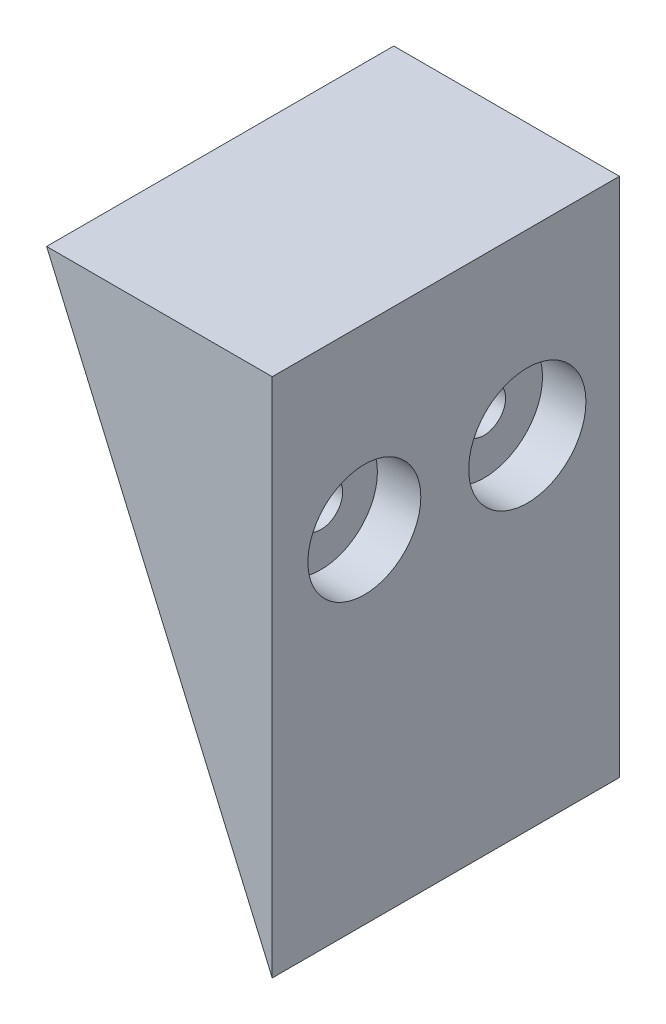
ISO-10303-21;
HEADER;
FILE_DESCRIPTION(('STEP AP214'),'2;1');
FILE_NAME('part.step','',(''),(''),'','','');
FILE_SCHEMA(('AUTOMOTIVE_DESIGN { 1 0 10303 214 1 1 1 1 }'));
ENDSEC;
DATA;
#1=APPLICATION_CONTEXT('core data for automotive mechanical design processes');
#2=APPLICATION_PROTOCOL_DEFINITION('international standard','automotive_design',2000,#1);
#3=PRODUCT_CONTEXT('',#1,'mechanical');
#4=PRODUCT('Part','Part','',(#3));
#5=PRODUCT_RELATED_PRODUCT_CATEGORY('part','',(#4));
#6=PRODUCT_DEFINITION_FORMATION('','',#4);
#7=PRODUCT_DEFINITION_CONTEXT('part definition',#1,'design');
#8=PRODUCT_DEFINITION('design','',#6,#7);
#9=PRODUCT_DEFINITION_SHAPE('','',#8);
#10=(LENGTH_UNIT() NAMED_UNIT(*) SI_UNIT(.MILLI.,.METRE.));
#11=(NAMED_UNIT(*) PLANE_ANGLE_UNIT() SI_UNIT($,.RADIAN.));
#12=(NAMED_UNIT(*) SI_UNIT($,.STERADIAN.) SOLID_ANGLE_UNIT());
#13=UNCERTAINTY_MEASURE_WITH_UNIT(LENGTH_MEASURE(1.E-05),#10,'distance_accuracy_value','');
#14=(GEOMETRIC_REPRESENTATION_CONTEXT(3) GLOBAL_UNCERTAINTY_ASSIGNED_CONTEXT((#13)) GLOBAL_UNIT_ASSIGNED_CONTEXT((#10,
#11,#12)) REPRESENTATION_CONTEXT('',''));
#15=CARTESIAN_POINT('',(0.,0.,0.));
#16=DIRECTION('',(0.,0.,1.));
#17=DIRECTION('',(1.,0.,0.));
#18=AXIS2_PLACEMENT_3D('',#15,#16,#17);
#19=CARTESIAN_POINT('',(-80.,39.440308957154,10.6119529384827));
#20=DIRECTION('',(1.,0.,0.));
#21=DIRECTION('',(0.,0.,-1.));
#22=AXIS2_PLACEMENT_3D('',#19,#20,#21);
#23=CYLINDRICAL_SURFACE('',#22,2.5);
#24=CARTESIAN_POINT('',(-17.0908005481001,39.440308957154,10.6119529384827));
#25=DIRECTION('',(0.917555625309924,0.397607437634301,0.));
#26=DIRECTION('',(0.3976074376343,-0.917555625309924,0.));
#27=AXIS2_PLACEMENT_3D('',#24,#25,#26);
#28=ELLIPSE('',#27,2.7246304540453,2.5);
#29=CARTESIAN_POINT('',(-16.0074672147667,36.940308957154,10.6119529384827));
#30=VERTEX_POINT('',#29);
#31=EDGE_CURVE('E90',#30,#30,#28,.T.);
#32=ORIENTED_EDGE('',*,*,#31,.F.);
#33=EDGE_LOOP('',(#32));
#34=FACE_BOUND('',#33,.T.);
#35=CARTESIAN_POINT('',(-5.,39.440308957154,10.6119529384827));
#36=DIRECTION('',(1.,0.,0.));
#37=DIRECTION('',(0.,0.,-1.));
#38=AXIS2_PLACEMENT_3D('',#35,#36,#37);
#39=CIRCLE('',#38,2.5);
#40=CARTESIAN_POINT('',(-5.,39.440308957154,8.11195293848271));
#41=VERTEX_POINT('',#40);
#42=EDGE_CURVE('E37',#41,#41,#39,.F.);
#43=ORIENTED_EDGE('',*,*,#42,.F.);
#44=EDGE_LOOP('',(#43));
#45=FACE_BOUND('',#44,.T.);
#46=ADVANCED_FACE('F33',(#34,#45),#23,.F.);
#47=CARTESIAN_POINT('',(-80.,39.440308957154,29.3880470615173));
#48=DIRECTION('',(1.,0.,0.));
#49=DIRECTION('',(0.,0.,-1.));
#50=AXIS2_PLACEMENT_3D('',#47,#48,#49);
#51=CYLINDRICAL_SURFACE('',#50,2.5);
#52=CARTESIAN_POINT('',(-17.0908005481001,39.440308957154,29.3880470615173));
#53=DIRECTION('',(0.917555625309924,0.397607437634301,0.));
#54=DIRECTION('',(0.3976074376343,-0.917555625309924,0.));
#55=AXIS2_PLACEMENT_3D('',#52,#53,#54);
#56=ELLIPSE('',#55,2.7246304540453,2.5);
#57=CARTESIAN_POINT('',(-16.0074672147667,36.940308957154,29.3880470615173));
#58=VERTEX_POINT('',#57);
#59=EDGE_CURVE('E86',#58,#58,#56,.T.);
#60=ORIENTED_EDGE('',*,*,#59,.F.);
#61=EDGE_LOOP('',(#60));
#62=FACE_BOUND('',#61,.T.);
#63=CARTESIAN_POINT('',(-5.,39.440308957154,29.3880470615173));
#64=DIRECTION('',(1.,0.,0.));
#65=DIRECTION('',(0.,0.,-1.));
#66=AXIS2_PLACEMENT_3D('',#63,#64,#65);
#67=CIRCLE('',#66,2.5);
#68=CARTESIAN_POINT('',(-5.,39.440308957154,26.8880470615173));
#69=VERTEX_POINT('',#68);
#70=EDGE_CURVE('E96',#69,#69,#67,.F.);
#71=ORIENTED_EDGE('',*,*,#70,.F.);
#72=EDGE_LOOP('',(#71));
#73=FACE_BOUND('',#72,.T.);
#74=ADVANCED_FACE('F124',(#62,#73),#51,.F.);
#75=CARTESIAN_POINT('',(-26.,60.,40.));
#76=DIRECTION('',(0.917555625309924,0.397607437634301,0.));
#77=DIRECTION('',(-0.3976074376343,0.917555625309924,0.));
#78=AXIS2_PLACEMENT_3D('',#75,#76,#77);
#79=PLANE('',#78);
#80=ORIENTED_EDGE('',*,*,#31,.T.);
#81=EDGE_LOOP('',(#80));
#82=FACE_BOUND('',#81,.T.);
#83=ORIENTED_EDGE('',*,*,#59,.T.);
#84=EDGE_LOOP('',(#83));
#85=FACE_BOUND('',#84,.T.);
#86=DIRECTION('',(0.397607437634301,-0.917555625309924,0.));
#87=VECTOR('',#86,1.);
#88=CARTESIAN_POINT('',(-26.,60.,0.));
#89=LINE('',#88,#87);
#90=CARTESIAN_POINT('',(-26.,60.,0.));
#91=VERTEX_POINT('',#90);
#92=CARTESIAN_POINT('',(0.,0.,0.));
#93=VERTEX_POINT('',#92);
#94=EDGE_CURVE('E83',#91,#93,#89,.T.);
#95=ORIENTED_EDGE('',*,*,#94,.T.);
#96=DIRECTION('',(0.,0.,-1.));
#97=VECTOR('',#96,1.);
#98=CARTESIAN_POINT('',(0.,0.,40.));
#99=LINE('',#98,#97);
#100=CARTESIAN_POINT('',(0.,0.,40.));
#101=VERTEX_POINT('',#100);
#102=EDGE_CURVE('E11',#101,#93,#99,.T.);
#103=ORIENTED_EDGE('',*,*,#102,.F.);
#104=DIRECTION('',(0.397607437634301,-0.917555625309924,0.));
#105=VECTOR('',#104,1.);
#106=CARTESIAN_POINT('',(-26.,60.,40.));
#107=LINE('',#106,#105);
#108=CARTESIAN_POINT('',(-26.,60.,40.));
#109=VERTEX_POINT('',#108);
#110=EDGE_CURVE('E76',#109,#101,#107,.T.);
#111=ORIENTED_EDGE('',*,*,#110,.F.);
#112=DIRECTION('',(0.,0.,-1.));
#113=VECTOR('',#112,1.);
#114=CARTESIAN_POINT('',(-26.,60.,40.));
#115=LINE('',#114,#113);
#116=EDGE_CURVE('E84',#109,#91,#115,.T.);
#117=ORIENTED_EDGE('',*,*,#116,.T.);
#118=EDGE_LOOP('',(#95,#103,#111,#117));
#119=FACE_BOUND('',#118,.T.);
#120=ADVANCED_FACE('F35',(#82,#85,#119),#79,.F.);
#121=CARTESIAN_POINT('',(0.,0.,40.));
#122=DIRECTION('',(-1.,0.,0.));
#123=DIRECTION('',(0.,0.,1.));
#124=AXIS2_PLACEMENT_3D('',#121,#122,#123);
#125=PLANE('',#124);
#126=CARTESIAN_POINT('',(0.,39.440308957154,10.6119529384827));
#127=DIRECTION('',(1.,0.,0.));
#128=DIRECTION('',(0.,0.,-1.));
#129=AXIS2_PLACEMENT_3D('',#126,#127,#128);
#130=CIRCLE('',#129,6.75580610171235);
#131=CARTESIAN_POINT('',(0.,39.440308957154,3.85614683677037));
#132=VERTEX_POINT('',#131);
#133=EDGE_CURVE('E111',#132,#132,#130,.T.);
#134=ORIENTED_EDGE('',*,*,#133,.F.);
#135=EDGE_LOOP('',(#134));
#136=FACE_BOUND('',#135,.T.);
#137=CARTESIAN_POINT('',(0.,39.440308957154,29.3880470615173));
#138=DIRECTION('',(1.,0.,0.));
#139=DIRECTION('',(0.,0.,-1.));
#140=AXIS2_PLACEMENT_3D('',#137,#138,#139);
#141=CIRCLE('',#140,6.50511993876965);
#142=CARTESIAN_POINT('',(0.,39.440308957154,22.8829271227476));
#143=VERTEX_POINT('',#142);
#144=EDGE_CURVE('E104',#143,#143,#141,.T.);
#145=ORIENTED_EDGE('',*,*,#144,.F.);
#146=EDGE_LOOP('',(#145));
#147=FACE_BOUND('',#146,.T.);
#148=DIRECTION('',(0.,1.,0.));
#149=VECTOR('',#148,1.);
#150=CARTESIAN_POINT('',(0.,0.,0.));
#151=LINE('',#150,#149);
#152=CARTESIAN_POINT('',(0.,60.,0.));
#153=VERTEX_POINT('',#152);
#154=EDGE_CURVE('E64',#93,#153,#151,.T.);
#155=ORIENTED_EDGE('',*,*,#154,.T.);
#156=DIRECTION('',(0.,0.,-1.));
#157=VECTOR('',#156,1.);
#158=CARTESIAN_POINT('',(0.,60.,40.));
#159=LINE('',#158,#157);
#160=CARTESIAN_POINT('',(0.,60.,40.));
#161=VERTEX_POINT('',#160);
#162=EDGE_CURVE('E43',#161,#153,#159,.T.);
#163=ORIENTED_EDGE('',*,*,#162,.F.);
#164=DIRECTION('',(0.,1.,0.));
#165=VECTOR('',#164,1.);
#166=CARTESIAN_POINT('',(0.,0.,40.));
#167=LINE('',#166,#165);
#168=EDGE_CURVE('E72',#101,#161,#167,.T.);
#169=ORIENTED_EDGE('',*,*,#168,.F.);
#170=ORIENTED_EDGE('',*,*,#102,.T.);
#171=EDGE_LOOP('',(#155,#163,#169,#170));
#172=FACE_BOUND('',#171,.T.);
#173=ADVANCED_FACE('F73',(#136,#147,#172),#125,.F.);
#174=CARTESIAN_POINT('',(0.,60.,40.));
#175=DIRECTION('',(0.,-1.,0.));
#176=DIRECTION('',(1.,0.,0.));
#177=AXIS2_PLACEMENT_3D('',#174,#175,#176);
#178=PLANE('',#177);
#179=DIRECTION('',(-1.,0.,0.));
#180=VECTOR('',#179,1.);
#181=CARTESIAN_POINT('',(0.,60.,0.));
#182=LINE('',#181,#180);
#183=EDGE_CURVE('E69',#153,#91,#182,.T.);
#184=ORIENTED_EDGE('',*,*,#183,.T.);
#185=ORIENTED_EDGE('',*,*,#116,.F.);
#186=DIRECTION('',(-1.,0.,0.));
#187=VECTOR('',#186,1.);
#188=CARTESIAN_POINT('',(0.,60.,40.));
#189=LINE('',#188,#187);
#190=EDGE_CURVE('E52',#161,#109,#189,.T.);
#191=ORIENTED_EDGE('',*,*,#190,.F.);
#192=ORIENTED_EDGE('',*,*,#162,.T.);
#193=EDGE_LOOP('',(#184,#185,#191,#192));
#194=FACE_BOUND('',#193,.T.);
#195=ADVANCED_FACE('F140',(#194),#178,.F.);
#196=CARTESIAN_POINT('',(0.,0.,40.));
#197=DIRECTION('',(0.,0.,-1.));
#198=DIRECTION('',(-1.,0.,0.));
#199=AXIS2_PLACEMENT_3D('',#196,#197,#198);
#200=PLANE('',#199);
#201=ORIENTED_EDGE('',*,*,#110,.T.);
#202=ORIENTED_EDGE('',*,*,#168,.T.);
#203=ORIENTED_EDGE('',*,*,#190,.T.);
#204=EDGE_LOOP('',(#201,#202,#203));
#205=FACE_BOUND('',#204,.T.);
#206=ADVANCED_FACE('F79',(#205),#200,.F.);
#207=CARTESIAN_POINT('',(0.,0.,0.));
#208=DIRECTION('',(0.,0.,-1.));
#209=DIRECTION('',(-1.,0.,0.));
#210=AXIS2_PLACEMENT_3D('',#207,#208,#209);
#211=PLANE('',#210);
#212=ORIENTED_EDGE('',*,*,#94,.F.);
#213=ORIENTED_EDGE('',*,*,#183,.F.);
#214=ORIENTED_EDGE('',*,*,#154,.F.);
#215=EDGE_LOOP('',(#212,#213,#214));
#216=FACE_BOUND('',#215,.T.);
#217=ADVANCED_FACE('F139',(#216),#211,.T.);
#218=CARTESIAN_POINT('',(-5.,39.440308957154,29.3880470615173));
#219=DIRECTION('',(1.,0.,0.));
#220=DIRECTION('',(0.,0.,-1.));
#221=AXIS2_PLACEMENT_3D('',#218,#219,#220);
#222=PLANE('',#221);
#223=CARTESIAN_POINT('',(-5.,39.440308957154,29.3880470615173));
#224=DIRECTION('',(1.,0.,0.));
#225=DIRECTION('',(0.,0.,-1.));
#226=AXIS2_PLACEMENT_3D('',#223,#224,#225);
#227=CIRCLE('',#226,6.50511993876965);
#228=CARTESIAN_POINT('',(-5.,39.440308957154,22.8829271227476));
#229=VERTEX_POINT('',#228);
#230=EDGE_CURVE('E98',#229,#229,#227,.T.);
#231=ORIENTED_EDGE('',*,*,#230,.T.);
#232=EDGE_LOOP('',(#231));
#233=FACE_BOUND('',#232,.T.);
#234=ORIENTED_EDGE('',*,*,#70,.T.);
#235=EDGE_LOOP('',(#234));
#236=FACE_BOUND('',#235,.T.);
#237=ADVANCED_FACE('F143',(#233,#236),#222,.T.);
#238=CARTESIAN_POINT('',(-5.,39.440308957154,29.3880470615173));
#239=DIRECTION('',(1.,0.,0.));
#240=DIRECTION('',(0.,0.,-1.));
#241=AXIS2_PLACEMENT_3D('',#238,#239,#240);
#242=CYLINDRICAL_SURFACE('',#241,6.50511993876965);
#243=ORIENTED_EDGE('',*,*,#230,.F.);
#244=EDGE_LOOP('',(#243));
#245=FACE_BOUND('',#244,.T.);
#246=ORIENTED_EDGE('',*,*,#144,.T.);
#247=EDGE_LOOP('',(#246));
#248=FACE_BOUND('',#247,.T.);
#249=ADVANCED_FACE('F134',(#245,#248),#242,.F.);
#250=CARTESIAN_POINT('',(-5.,39.440308957154,10.6119529384827));
#251=DIRECTION('',(1.,0.,0.));
#252=DIRECTION('',(0.,0.,-1.));
#253=AXIS2_PLACEMENT_3D('',#250,#251,#252);
#254=PLANE('',#253);
#255=CARTESIAN_POINT('',(-5.,39.440308957154,10.6119529384827));
#256=DIRECTION('',(1.,0.,0.));
#257=DIRECTION('',(0.,0.,-1.));
#258=AXIS2_PLACEMENT_3D('',#255,#256,#257);
#259=CIRCLE('',#258,6.75580610171235);
#260=CARTESIAN_POINT('',(-5.,39.440308957154,3.85614683677037));
#261=VERTEX_POINT('',#260);
#262=EDGE_CURVE('E114',#261,#261,#259,.T.);
#263=ORIENTED_EDGE('',*,*,#262,.T.);
#264=EDGE_LOOP('',(#263));
#265=FACE_BOUND('',#264,.T.);
#266=ORIENTED_EDGE('',*,*,#42,.T.);
#267=EDGE_LOOP('',(#266));
#268=FACE_BOUND('',#267,.T.);
#269=ADVANCED_FACE('F121',(#265,#268),#254,.T.);
#270=CARTESIAN_POINT('',(-5.,39.440308957154,10.6119529384827));
#271=DIRECTION('',(1.,0.,0.));
#272=DIRECTION('',(0.,0.,-1.));
#273=AXIS2_PLACEMENT_3D('',#270,#271,#272);
#274=CYLINDRICAL_SURFACE('',#273,6.75580610171235);
#275=ORIENTED_EDGE('',*,*,#262,.F.);
#276=EDGE_LOOP('',(#275));
#277=FACE_BOUND('',#276,.T.);
#278=ORIENTED_EDGE('',*,*,#133,.T.);
#279=EDGE_LOOP('',(#278));
#280=FACE_BOUND('',#279,.T.);
#281=ADVANCED_FACE('F161',(#277,#280),#274,.F.);
#282=CLOSED_SHELL('',(#46,#74,#120,#173,#195,#206,#217,#237,#249,#269,#281));
#283=MANIFOLD_SOLID_BREP('B2',#282);
#284=ADVANCED_BREP_SHAPE_REPRESENTATION('',(#18,#283),#14);
#285=SHAPE_DEFINITION_REPRESENTATION(#9,#284);
ENDSEC;
END-ISO-10303-21;
